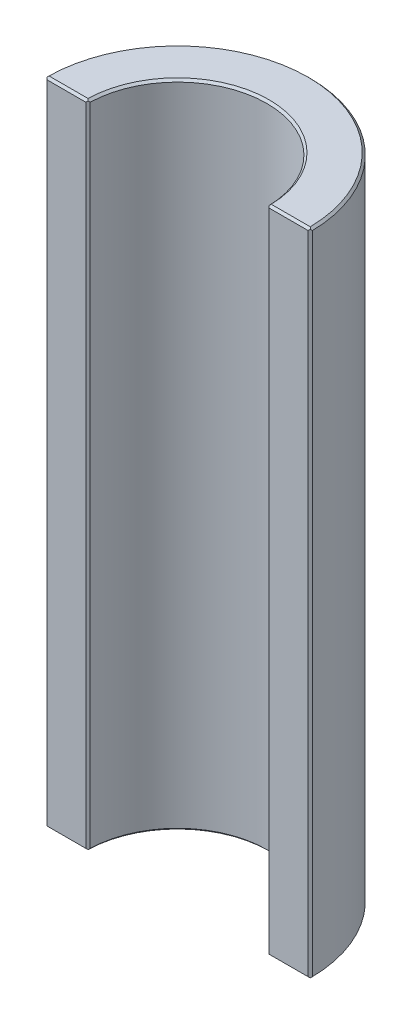
ISO-10303-21;
HEADER;
FILE_DESCRIPTION(('STEP AP214'),'2;1');
FILE_NAME('part.step','',(''),(''),'','','');
FILE_SCHEMA(('AUTOMOTIVE_DESIGN { 1 0 10303 214 1 1 1 1 }'));
ENDSEC;
DATA;
#1=APPLICATION_CONTEXT('core data for automotive mechanical design processes');
#2=APPLICATION_PROTOCOL_DEFINITION('international standard','automotive_design',2000,#1);
#3=PRODUCT_CONTEXT('',#1,'mechanical');
#4=PRODUCT('Part','Part','',(#3));
#5=PRODUCT_RELATED_PRODUCT_CATEGORY('part','',(#4));
#6=PRODUCT_DEFINITION_FORMATION('','',#4);
#7=PRODUCT_DEFINITION_CONTEXT('part definition',#1,'design');
#8=PRODUCT_DEFINITION('design','',#6,#7);
#9=PRODUCT_DEFINITION_SHAPE('','',#8);
#10=(LENGTH_UNIT() NAMED_UNIT(*) SI_UNIT(.MILLI.,.METRE.));
#11=(NAMED_UNIT(*) PLANE_ANGLE_UNIT() SI_UNIT($,.RADIAN.));
#12=(NAMED_UNIT(*) SI_UNIT($,.STERADIAN.) SOLID_ANGLE_UNIT());
#13=UNCERTAINTY_MEASURE_WITH_UNIT(LENGTH_MEASURE(1.E-05),#10,'distance_accuracy_value','');
#14=(GEOMETRIC_REPRESENTATION_CONTEXT(3) GLOBAL_UNCERTAINTY_ASSIGNED_CONTEXT((#13)) GLOBAL_UNIT_ASSIGNED_CONTEXT((#10,
#11,#12)) REPRESENTATION_CONTEXT('',''));
#15=CARTESIAN_POINT('',(0.,0.,0.));
#16=DIRECTION('',(0.,0.,1.));
#17=DIRECTION('',(1.,0.,0.));
#18=AXIS2_PLACEMENT_3D('',#15,#16,#17);
#19=CARTESIAN_POINT('',(0.,120.,0.));
#20=DIRECTION('',(0.,-1.,0.));
#21=DIRECTION('',(0.,0.,-1.));
#22=AXIS2_PLACEMENT_3D('',#19,#20,#21);
#23=CYLINDRICAL_SURFACE('',#22,24.5);
#24=DIRECTION('',(0.,-1.,0.));
#25=VECTOR('',#24,1.);
#26=CARTESIAN_POINT('',(24.4966251700169,120.,-0.406639004149389));
#27=LINE('',#26,#25);
#28=CARTESIAN_POINT('',(24.4966251700169,119.6,-0.406639004149389));
#29=VERTEX_POINT('',#28);
#30=CARTESIAN_POINT('',(24.4966251700169,0.399999999999998,-0.406639004149389));
#31=VERTEX_POINT('',#30);
#32=EDGE_CURVE('E209',#29,#31,#27,.T.);
#33=ORIENTED_EDGE('',*,*,#32,.T.);
#34=CARTESIAN_POINT('',(0.,0.399999999999998,0.));
#35=DIRECTION('',(0.,1.,0.));
#36=DIRECTION('',(0.,0.,1.));
#37=AXIS2_PLACEMENT_3D('',#34,#35,#36);
#38=CIRCLE('',#37,24.5);
#39=CARTESIAN_POINT('',(-24.4966251700169,0.399999999999998,-0.406639004149389));
#40=VERTEX_POINT('',#39);
#41=EDGE_CURVE('E242',#31,#40,#38,.T.);
#42=ORIENTED_EDGE('',*,*,#41,.T.);
#43=DIRECTION('',(0.,-1.,0.));
#44=VECTOR('',#43,1.);
#45=CARTESIAN_POINT('',(-24.4966251700169,120.,-0.406639004149389));
#46=LINE('',#45,#44);
#47=CARTESIAN_POINT('',(-24.4966251700169,119.6,-0.406639004149389));
#48=VERTEX_POINT('',#47);
#49=EDGE_CURVE('E206',#40,#48,#46,.F.);
#50=ORIENTED_EDGE('',*,*,#49,.T.);
#51=CARTESIAN_POINT('',(0.,119.6,0.));
#52=DIRECTION('',(0.,1.,0.));
#53=DIRECTION('',(0.,0.,1.));
#54=AXIS2_PLACEMENT_3D('',#51,#52,#53);
#55=CIRCLE('',#54,24.5);
#56=EDGE_CURVE('E227',#48,#29,#55,.F.);
#57=ORIENTED_EDGE('',*,*,#56,.T.);
#58=EDGE_LOOP('',(#33,#42,#50,#57));
#59=FACE_BOUND('',#58,.T.);
#60=ADVANCED_FACE('F43',(#59),#23,.T.);
#61=CARTESIAN_POINT('',(-24.5,120.,0.));
#62=DIRECTION('',(0.,0.,-1.));
#63=DIRECTION('',(-1.,0.,0.));
#64=AXIS2_PLACEMENT_3D('',#61,#62,#63);
#65=PLANE('',#64);
#66=DIRECTION('',(-1.,0.,0.));
#67=VECTOR('',#66,1.);
#68=CARTESIAN_POINT('',(-24.5,119.6,0.));
#69=LINE('',#68,#67);
#70=CARTESIAN_POINT('',(-16.8952656090397,119.6,0.));
#71=VERTEX_POINT('',#70);
#72=CARTESIAN_POINT('',(-24.0966802692819,119.6,0.));
#73=VERTEX_POINT('',#72);
#74=EDGE_CURVE('E223',#71,#73,#69,.T.);
#75=ORIENTED_EDGE('',*,*,#74,.T.);
#76=DIRECTION('',(0.,-1.,0.));
#77=VECTOR('',#76,1.);
#78=CARTESIAN_POINT('',(-24.0966802692819,120.,0.));
#79=LINE('',#78,#77);
#80=CARTESIAN_POINT('',(-24.0966802692819,0.400000000000011,0.));
#81=VERTEX_POINT('',#80);
#82=EDGE_CURVE('E225',#73,#81,#79,.T.);
#83=ORIENTED_EDGE('',*,*,#82,.T.);
#84=DIRECTION('',(1.,0.,0.));
#85=VECTOR('',#84,1.);
#86=CARTESIAN_POINT('',(-24.5,0.400000000000011,0.));
#87=LINE('',#86,#85);
#88=CARTESIAN_POINT('',(-16.8952656090397,0.400000000000011,0.));
#89=VERTEX_POINT('',#88);
#90=EDGE_CURVE('E218',#81,#89,#87,.T.);
#91=ORIENTED_EDGE('',*,*,#90,.T.);
#92=DIRECTION('',(0.,1.,0.));
#93=VECTOR('',#92,1.);
#94=CARTESIAN_POINT('',(-16.8952656090397,120.,0.));
#95=LINE('',#94,#93);
#96=EDGE_CURVE('E221',#89,#71,#95,.T.);
#97=ORIENTED_EDGE('',*,*,#96,.T.);
#98=EDGE_LOOP('',(#75,#83,#91,#97));
#99=FACE_BOUND('',#98,.T.);
#100=ADVANCED_FACE('F421',(#99),#65,.F.);
#101=CARTESIAN_POINT('',(0.,120.,0.));
#102=DIRECTION('',(0.,-1.,0.));
#103=DIRECTION('',(0.,0.,-1.));
#104=AXIS2_PLACEMENT_3D('',#101,#102,#103);
#105=CYLINDRICAL_SURFACE('',#104,16.5);
#106=DIRECTION('',(0.,-1.,0.));
#107=VECTOR('',#106,1.);
#108=CARTESIAN_POINT('',(-16.4953776656305,120.,-0.390532544378709));
#109=LINE('',#108,#107);
#110=CARTESIAN_POINT('',(-16.4953776656305,119.6,-0.390532544378709));
#111=VERTEX_POINT('',#110);
#112=CARTESIAN_POINT('',(-16.4953776656305,0.399999999999998,-0.390532544378709));
#113=VERTEX_POINT('',#112);
#114=EDGE_CURVE('E191',#111,#113,#109,.T.);
#115=ORIENTED_EDGE('',*,*,#114,.T.);
#116=CARTESIAN_POINT('',(0.,0.399999999999998,0.));
#117=DIRECTION('',(0.,1.,0.));
#118=DIRECTION('',(0.,0.,1.));
#119=AXIS2_PLACEMENT_3D('',#116,#117,#118);
#120=CIRCLE('',#119,16.5);
#121=CARTESIAN_POINT('',(16.4953776656305,0.399999999999998,-0.390532544378709));
#122=VERTEX_POINT('',#121);
#123=EDGE_CURVE('E569',#113,#122,#120,.F.);
#124=ORIENTED_EDGE('',*,*,#123,.T.);
#125=DIRECTION('',(0.,-1.,0.));
#126=VECTOR('',#125,1.);
#127=CARTESIAN_POINT('',(16.4953776656305,120.,-0.390532544378709));
#128=LINE('',#127,#126);
#129=CARTESIAN_POINT('',(16.4953776656305,119.6,-0.390532544378709));
#130=VERTEX_POINT('',#129);
#131=EDGE_CURVE('E194',#122,#130,#128,.F.);
#132=ORIENTED_EDGE('',*,*,#131,.T.);
#133=CARTESIAN_POINT('',(0.,119.6,0.));
#134=DIRECTION('',(0.,1.,0.));
#135=DIRECTION('',(0.,0.,1.));
#136=AXIS2_PLACEMENT_3D('',#133,#134,#135);
#137=CIRCLE('',#136,16.5);
#138=EDGE_CURVE('E572',#130,#111,#137,.T.);
#139=ORIENTED_EDGE('',*,*,#138,.T.);
#140=EDGE_LOOP('',(#115,#124,#132,#139));
#141=FACE_BOUND('',#140,.T.);
#142=ADVANCED_FACE('F428',(#141),#105,.F.);
#143=CARTESIAN_POINT('',(16.5,120.,0.));
#144=DIRECTION('',(0.,0.,-1.));
#145=DIRECTION('',(-1.,0.,0.));
#146=AXIS2_PLACEMENT_3D('',#143,#144,#145);
#147=PLANE('',#146);
#148=DIRECTION('',(-1.,0.,0.));
#149=VECTOR('',#148,1.);
#150=CARTESIAN_POINT('',(16.5,119.6,0.));
#151=LINE('',#150,#149);
#152=CARTESIAN_POINT('',(24.0966802692819,119.6,0.));
#153=VERTEX_POINT('',#152);
#154=CARTESIAN_POINT('',(16.8952656090397,119.6,0.));
#155=VERTEX_POINT('',#154);
#156=EDGE_CURVE('E189',#153,#155,#151,.T.);
#157=ORIENTED_EDGE('',*,*,#156,.T.);
#158=DIRECTION('',(0.,-1.,0.));
#159=VECTOR('',#158,1.);
#160=CARTESIAN_POINT('',(16.8952656090397,120.,0.));
#161=LINE('',#160,#159);
#162=CARTESIAN_POINT('',(16.8952656090397,0.400000000000011,0.));
#163=VERTEX_POINT('',#162);
#164=EDGE_CURVE('E169',#155,#163,#161,.T.);
#165=ORIENTED_EDGE('',*,*,#164,.T.);
#166=DIRECTION('',(1.,0.,0.));
#167=VECTOR('',#166,1.);
#168=CARTESIAN_POINT('',(16.5,0.400000000000011,0.));
#169=LINE('',#168,#167);
#170=CARTESIAN_POINT('',(24.0966802692819,0.400000000000011,0.));
#171=VERTEX_POINT('',#170);
#172=EDGE_CURVE('E177',#163,#171,#169,.T.);
#173=ORIENTED_EDGE('',*,*,#172,.T.);
#174=DIRECTION('',(0.,1.,0.));
#175=VECTOR('',#174,1.);
#176=CARTESIAN_POINT('',(24.0966802692819,120.,0.));
#177=LINE('',#176,#175);
#178=EDGE_CURVE('E184',#171,#153,#177,.T.);
#179=ORIENTED_EDGE('',*,*,#178,.T.);
#180=EDGE_LOOP('',(#157,#165,#173,#179));
#181=FACE_BOUND('',#180,.T.);
#182=ADVANCED_FACE('F187',(#181),#147,.F.);
#183=CARTESIAN_POINT('',(0.,120.,0.));
#184=DIRECTION('',(0.,1.,0.));
#185=DIRECTION('',(0.,0.,1.));
#186=AXIS2_PLACEMENT_3D('',#183,#184,#185);
#187=PLANE('',#186);
#188=DIRECTION('',(1.,0.,0.));
#189=VECTOR('',#188,1.);
#190=CARTESIAN_POINT('',(-16.5,120.,-0.400000000000011));
#191=LINE('',#190,#189);
#192=CARTESIAN_POINT('',(-24.096680269282,120.,-0.400000000000011));
#193=VERTEX_POINT('',#192);
#194=CARTESIAN_POINT('',(-16.8952656090397,120.,-0.400000000000011));
#195=VERTEX_POINT('',#194);
#196=EDGE_CURVE('E201',#193,#195,#191,.T.);
#197=ORIENTED_EDGE('',*,*,#196,.T.);
#198=CARTESIAN_POINT('',(0.,120.,0.));
#199=DIRECTION('',(0.,1.,0.));
#200=DIRECTION('',(0.,0.,1.));
#201=AXIS2_PLACEMENT_3D('',#198,#199,#200);
#202=CIRCLE('',#201,16.9);
#203=CARTESIAN_POINT('',(16.8952656090397,120.,-0.400000000000011));
#204=VERTEX_POINT('',#203);
#205=EDGE_CURVE('E407',#195,#204,#202,.F.);
#206=ORIENTED_EDGE('',*,*,#205,.T.);
#207=DIRECTION('',(1.,0.,0.));
#208=VECTOR('',#207,1.);
#209=CARTESIAN_POINT('',(24.5,120.,-0.400000000000011));
#210=LINE('',#209,#208);
#211=CARTESIAN_POINT('',(24.096680269282,120.,-0.400000000000011));
#212=VERTEX_POINT('',#211);
#213=EDGE_CURVE('E203',#204,#212,#210,.T.);
#214=ORIENTED_EDGE('',*,*,#213,.T.);
#215=CARTESIAN_POINT('',(0.,120.,0.));
#216=DIRECTION('',(0.,1.,0.));
#217=DIRECTION('',(0.,0.,1.));
#218=AXIS2_PLACEMENT_3D('',#215,#216,#217);
#219=CIRCLE('',#218,24.1);
#220=EDGE_CURVE('E406',#212,#193,#219,.T.);
#221=ORIENTED_EDGE('',*,*,#220,.T.);
#222=EDGE_LOOP('',(#197,#206,#214,#221));
#223=FACE_BOUND('',#222,.T.);
#224=ADVANCED_FACE('F415',(#223),#187,.T.);
#225=CARTESIAN_POINT('',(0.,0.,0.));
#226=DIRECTION('',(0.,1.,0.));
#227=DIRECTION('',(0.,0.,1.));
#228=AXIS2_PLACEMENT_3D('',#225,#226,#227);
#229=PLANE('',#228);
#230=DIRECTION('',(-1.,0.,0.));
#231=VECTOR('',#230,1.);
#232=CARTESIAN_POINT('',(0.,0.,-0.400000000000012));
#233=LINE('',#232,#231);
#234=CARTESIAN_POINT('',(-16.8952656090397,0.,-0.400000000000012));
#235=VERTEX_POINT('',#234);
#236=CARTESIAN_POINT('',(-24.0966802692819,0.,-0.400000000000012));
#237=VERTEX_POINT('',#236);
#238=EDGE_CURVE('E212',#235,#237,#233,.T.);
#239=ORIENTED_EDGE('',*,*,#238,.T.);
#240=CARTESIAN_POINT('',(0.,0.,0.));
#241=DIRECTION('',(0.,1.,0.));
#242=DIRECTION('',(0.,0.,1.));
#243=AXIS2_PLACEMENT_3D('',#240,#241,#242);
#244=CIRCLE('',#243,24.1);
#245=CARTESIAN_POINT('',(24.0966802692819,0.,-0.400000000000012));
#246=VERTEX_POINT('',#245);
#247=EDGE_CURVE('E566',#237,#246,#244,.F.);
#248=ORIENTED_EDGE('',*,*,#247,.T.);
#249=DIRECTION('',(-1.,0.,0.));
#250=VECTOR('',#249,1.);
#251=CARTESIAN_POINT('',(0.,0.,-0.400000000000012));
#252=LINE('',#251,#250);
#253=CARTESIAN_POINT('',(16.8952656090397,0.,-0.400000000000012));
#254=VERTEX_POINT('',#253);
#255=EDGE_CURVE('E215',#246,#254,#252,.T.);
#256=ORIENTED_EDGE('',*,*,#255,.T.);
#257=CARTESIAN_POINT('',(0.,0.,0.));
#258=DIRECTION('',(0.,1.,0.));
#259=DIRECTION('',(0.,0.,1.));
#260=AXIS2_PLACEMENT_3D('',#257,#258,#259);
#261=CIRCLE('',#260,16.9);
#262=EDGE_CURVE('E300',#254,#235,#261,.T.);
#263=ORIENTED_EDGE('',*,*,#262,.T.);
#264=EDGE_LOOP('',(#239,#248,#256,#263));
#265=FACE_BOUND('',#264,.T.);
#266=ADVANCED_FACE('F435',(#265),#229,.F.);
#267=CARTESIAN_POINT('',(24.4966251700169,120.,-0.406639004149389));
#268=DIRECTION('',(-0.712950738260874,0.,-0.701214121943701));
#269=DIRECTION('',(0.,-1.,0.));
#270=AXIS2_PLACEMENT_3D('',#267,#268,#269);
#271=PLANE('',#270);
#272=DIRECTION('',(-0.570961687828843,0.580518195680221,0.580518195680221));
#273=VECTOR('',#272,1.);
#274=CARTESIAN_POINT('',(21.6201834002038,2.91794739417949,2.51794739417948));
#275=LINE('',#274,#273);
#276=CARTESIAN_POINT('',(24.296246381414,0.197093637272933,-0.202906362727078));
#277=VERTEX_POINT('',#276);
#278=EDGE_CURVE('E181',#277,#171,#275,.T.);
#279=ORIENTED_EDGE('',*,*,#278,.F.);
#280=CARTESIAN_POINT('',(24.296246381414,0.197093637272933,-0.202906362727079));
#281=CARTESIAN_POINT('',(24.3296886206696,0.230819430337007,-0.236908343605977));
#282=CARTESIAN_POINT('',(24.3631079727455,0.264591190495307,-0.270887054229624));
#283=CARTESIAN_POINT('',(24.4299009022795,0.332226644738374,-0.338797934703367));
#284=CARTESIAN_POINT('',(24.4632744797378,0.36609033882243,-0.372730104553824));
#285=CARTESIAN_POINT('',(24.4966251700169,0.399999999999999,-0.40663900414939));
#286=B_SPLINE_CURVE_WITH_KNOTS('',3,(#280,#281,#282,#283,#284,#285),.UNSPECIFIED.,.F.,.F.,(4,2,
4),(0.,0.175235381350621,0.350470761343707),.UNSPECIFIED.);
#287=EDGE_CURVE('E575',#277,#31,#286,.T.);
#288=ORIENTED_EDGE('',*,*,#287,.T.);
#289=ORIENTED_EDGE('',*,*,#32,.F.);
#290=CARTESIAN_POINT('',(24.4966251700169,119.6,-0.406639004149389));
#291=CARTESIAN_POINT('',(24.4632744797378,119.633909661178,-0.372730104553827));
#292=CARTESIAN_POINT('',(24.4299009022795,119.667773355262,-0.338797934703373));
#293=CARTESIAN_POINT('',(24.3631079727455,119.735408809505,-0.270887054229633));
#294=CARTESIAN_POINT('',(24.3296886206696,119.769180569663,-0.236908343605987));
#295=CARTESIAN_POINT('',(24.296246381414,119.802906362727,-0.20290636272709));
#296=B_SPLINE_CURVE_WITH_KNOTS('',3,(#290,#291,#292,#293,#294,#295),.UNSPECIFIED.,.F.,.F.,(4,2,
4),(0.,0.175235379993074,0.35047076134368),.UNSPECIFIED.);
#297=CARTESIAN_POINT('',(24.296246381414,119.802906362727,-0.20290636272709));
#298=VERTEX_POINT('',#297);
#299=EDGE_CURVE('E326',#29,#298,#296,.T.);
#300=ORIENTED_EDGE('',*,*,#299,.T.);
#301=DIRECTION('',(0.570961687828843,0.580518195680221,-0.580518195680221));
#302=VECTOR('',#301,1.);
#303=CARTESIAN_POINT('',(24.494424647867,120.004401650619,-0.404401650618994));
#304=LINE('',#303,#302);
#305=EDGE_CURVE('E185',#153,#298,#304,.T.);
#306=ORIENTED_EDGE('',*,*,#305,.F.);
#307=ORIENTED_EDGE('',*,*,#178,.F.);
#308=EDGE_LOOP('',(#279,#288,#289,#300,#306,#307));
#309=FACE_BOUND('',#308,.T.);
#310=ADVANCED_FACE('F273',(#309),#271,.F.);
#311=CARTESIAN_POINT('',(0.,120.,-0.400000000000011));
#312=DIRECTION('',(0.,0.707106781186548,0.707106781186548));
#313=DIRECTION('',(-1.,0.,0.));
#314=AXIS2_PLACEMENT_3D('',#311,#312,#313);
#315=PLANE('',#314);
#316=ORIENTED_EDGE('',*,*,#213,.F.);
#317=CARTESIAN_POINT('',(16.8952656090397,120.,-0.400000000000011));
#318=CARTESIAN_POINT('',(16.8619746824803,119.965910755472,-0.365910755472117));
#319=CARTESIAN_POINT('',(16.8286164511445,119.931854572258,-0.331854572258257));
#320=CARTESIAN_POINT('',(16.7617653781253,119.86380832765,-0.263808327649576));
#321=CARTESIAN_POINT('',(16.7282725364386,119.829818266256,-0.229818266256328));
#322=CARTESIAN_POINT('',(16.6947123899723,119.795861266179,-0.195861266178686));
#323=B_SPLINE_CURVE_WITH_KNOTS('',3,(#317,#318,#319,#320,#321,#322),.UNSPECIFIED.,.F.,.F.,(4,2,
4),(0.,0.175760545778613,0.351521095736601),.UNSPECIFIED.);
#324=CARTESIAN_POINT('',(16.6947123899723,119.795861266179,-0.195861266178684));
#325=VERTEX_POINT('',#324);
#326=EDGE_CURVE('E362',#204,#325,#323,.T.);
#327=ORIENTED_EDGE('',*,*,#326,.T.);
#328=DIRECTION('',(-0.586460895294597,0.572740612446097,-0.572740612446097));
#329=VECTOR('',#328,1.);
#330=CARTESIAN_POINT('',(10.8156571095642,125.537375745527,-5.93737574552685));
#331=LINE('',#330,#329);
#332=EDGE_CURVE('E173',#155,#325,#331,.T.);
#333=ORIENTED_EDGE('',*,*,#332,.F.);
#334=ORIENTED_EDGE('',*,*,#156,.F.);
#335=ORIENTED_EDGE('',*,*,#305,.T.);
#336=CARTESIAN_POINT('',(24.296246381414,119.802906362727,-0.202906362727089));
#337=CARTESIAN_POINT('',(24.2630760423387,119.835801210659,-0.235801210659445));
#338=CARTESIAN_POINT('',(24.2298603635213,119.868673104335,-0.268673104334742));
#339=CARTESIAN_POINT('',(24.1633383261447,119.934370983426,-0.334370983426073));
#340=CARTESIAN_POINT('',(24.1300319675847,119.967196968842,-0.367196968841751));
#341=CARTESIAN_POINT('',(24.096680269282,120.,-0.400000000000013));
#342=B_SPLINE_CURVE_WITH_KNOTS('',3,(#336,#337,#338,#339,#340,#341),.UNSPECIFIED.,.F.,.F.,(4,2,
4),(0.,0.171404891884884,0.342809785099596),.UNSPECIFIED.);
#343=EDGE_CURVE('E355',#298,#212,#342,.T.);
#344=ORIENTED_EDGE('',*,*,#343,.T.);
#345=EDGE_LOOP('',(#316,#327,#333,#334,#335,#344));
#346=FACE_BOUND('',#345,.T.);
#347=ADVANCED_FACE('F344',(#346),#315,.T.);
#348=CARTESIAN_POINT('',(16.5,0.400000000000011,0.));
#349=DIRECTION('',(0.,0.707106781186548,-0.707106781186548));
#350=DIRECTION('',(1.,0.,0.));
#351=AXIS2_PLACEMENT_3D('',#348,#349,#350);
#352=PLANE('',#351);
#353=ORIENTED_EDGE('',*,*,#255,.F.);
#354=CARTESIAN_POINT('',(24.0966802692819,0.,-0.400000000000012));
#355=CARTESIAN_POINT('',(24.1300319675846,0.0328030311582622,-0.367196968841749));
#356=CARTESIAN_POINT('',(24.1633383261447,0.0656290165739405,-0.334370983426071));
#357=CARTESIAN_POINT('',(24.2298603635213,0.131326895665274,-0.268673104334737));
#358=CARTESIAN_POINT('',(24.2630760423387,0.164198789340574,-0.235801210659438));
#359=CARTESIAN_POINT('',(24.296246381414,0.197093637272933,-0.202906362727078));
#360=B_SPLINE_CURVE_WITH_KNOTS('',3,(#354,#355,#356,#357,#358,#359),.UNSPECIFIED.,.F.,.F.,(4,2,
4),(0.,0.17140489321472,0.342809785099614),.UNSPECIFIED.);
#361=EDGE_CURVE('E318',#246,#277,#360,.T.);
#362=ORIENTED_EDGE('',*,*,#361,.T.);
#363=ORIENTED_EDGE('',*,*,#278,.T.);
#364=ORIENTED_EDGE('',*,*,#172,.F.);
#365=DIRECTION('',(-0.586460895294597,-0.572740612446097,-0.572740612446097));
#366=VECTOR('',#365,1.);
#367=CARTESIAN_POINT('',(16.7593193856523,0.267234245510053,-0.132765754489959));
#368=LINE('',#367,#366);
#369=CARTESIAN_POINT('',(16.6947123899723,0.204138733821325,-0.195861266178687));
#370=VERTEX_POINT('',#369);
#371=EDGE_CURVE('E163',#370,#163,#368,.F.);
#372=ORIENTED_EDGE('',*,*,#371,.F.);
#373=CARTESIAN_POINT('',(16.6947123899723,0.204138733821325,-0.195861266178686));
#374=CARTESIAN_POINT('',(16.7282725364386,0.170181733743684,-0.229818266256327));
#375=CARTESIAN_POINT('',(16.7617653781253,0.136191672350436,-0.263808327649575));
#376=CARTESIAN_POINT('',(16.8286164511446,0.0681454277417557,-0.331854572258256));
#377=CARTESIAN_POINT('',(16.8619746824804,0.0340892445278956,-0.365910755472116));
#378=CARTESIAN_POINT('',(16.8952656090397,0.,-0.400000000000011));
#379=B_SPLINE_CURVE_WITH_KNOTS('',3,(#373,#374,#375,#376,#377,#378),.UNSPECIFIED.,.F.,.F.,(4,2,
4),(0.,0.175760549957989,0.351521095736602),.UNSPECIFIED.);
#380=EDGE_CURVE('E327',#370,#254,#379,.T.);
#381=ORIENTED_EDGE('',*,*,#380,.T.);
#382=EDGE_LOOP('',(#353,#362,#363,#364,#372,#381));
#383=FACE_BOUND('',#382,.T.);
#384=ADVANCED_FACE('F179',(#383),#352,.F.);
#385=CARTESIAN_POINT('',(16.8952656090397,120.,0.));
#386=DIRECTION('',(0.698688543253268,0.,-0.715425970682241));
#387=DIRECTION('',(0.,-1.,0.));
#388=AXIS2_PLACEMENT_3D('',#385,#386,#387);
#389=PLANE('',#388);
#390=ORIENTED_EDGE('',*,*,#131,.F.);
#391=CARTESIAN_POINT('',(16.4953776656305,0.399999999999998,-0.390532544378709));
#392=CARTESIAN_POINT('',(16.5286664825994,0.36748841085353,-0.358022520997208));
#393=CARTESIAN_POINT('',(16.5619221183098,0.334910843903552,-0.325544902596955));
#394=CARTESIAN_POINT('',(16.6283670264221,0.269623755174185,-0.260654476531824));
#395=CARTESIAN_POINT('',(16.6615562988257,0.236914233397939,-0.228241668865403));
#396=CARTESIAN_POINT('',(16.6947123899723,0.204138733821326,-0.195861266178686));
#397=B_SPLINE_CURVE_WITH_KNOTS('',3,(#391,#392,#393,#394,#395,#396),.UNSPECIFIED.,.F.,.F.,(4,2,
4),(0.,0.170288807167442,0.340577610278406),.UNSPECIFIED.);
#398=EDGE_CURVE('E170',#122,#370,#397,.T.);
#399=ORIENTED_EDGE('',*,*,#398,.T.);
#400=ORIENTED_EDGE('',*,*,#371,.T.);
#401=ORIENTED_EDGE('',*,*,#164,.F.);
#402=ORIENTED_EDGE('',*,*,#332,.T.);
#403=CARTESIAN_POINT('',(16.6947123899723,119.795861266179,-0.19586126617869));
#404=CARTESIAN_POINT('',(16.6615562988257,119.763085766602,-0.228241668865407));
#405=CARTESIAN_POINT('',(16.6283670264221,119.730376244826,-0.260654476531828));
#406=CARTESIAN_POINT('',(16.5619221183098,119.665089156096,-0.325544902596957));
#407=CARTESIAN_POINT('',(16.5286664825994,119.632511589146,-0.35802252099721));
#408=CARTESIAN_POINT('',(16.4953776656305,119.6,-0.390532544378709));
#409=B_SPLINE_CURVE_WITH_KNOTS('',3,(#403,#404,#405,#406,#407,#408),.UNSPECIFIED.,.F.,.F.,(4,2,
4),(0.,0.170288803110958,0.34057761027839),.UNSPECIFIED.);
#410=EDGE_CURVE('E381',#325,#130,#409,.T.);
#411=ORIENTED_EDGE('',*,*,#410,.T.);
#412=EDGE_LOOP('',(#390,#399,#400,#401,#402,#411));
#413=FACE_BOUND('',#412,.T.);
#414=ADVANCED_FACE('F166',(#413),#389,.F.);
#415=CARTESIAN_POINT('',(-16.4953776656305,120.,-0.390532544378709));
#416=DIRECTION('',(-0.698688543253268,0.,-0.715425970682241));
#417=DIRECTION('',(0.,-1.,0.));
#418=AXIS2_PLACEMENT_3D('',#415,#416,#417);
#419=PLANE('',#418);
#420=DIRECTION('',(-0.586460895294597,0.572740612446097,0.572740612446097));
#421=VECTOR('',#420,1.);
#422=CARTESIAN_POINT('',(-19.5108104393302,2.95435402428376,2.55435402428375));
#423=LINE('',#422,#421);
#424=CARTESIAN_POINT('',(-16.6947123899723,0.204138733821324,-0.195861266178687));
#425=VERTEX_POINT('',#424);
#426=EDGE_CURVE('E238',#425,#89,#423,.T.);
#427=ORIENTED_EDGE('',*,*,#426,.F.);
#428=CARTESIAN_POINT('',(-16.6947123899723,0.204138733821325,-0.195861266178686));
#429=CARTESIAN_POINT('',(-16.6615562988257,0.236914233397938,-0.228241668865404));
#430=CARTESIAN_POINT('',(-16.6283670264221,0.269623755174185,-0.260654476531824));
#431=CARTESIAN_POINT('',(-16.5619221183098,0.334910843903553,-0.325544902596955));
#432=CARTESIAN_POINT('',(-16.5286664825994,0.367488410853531,-0.358022520997209));
#433=CARTESIAN_POINT('',(-16.4953776656305,0.399999999999998,-0.39053254437871));
#434=B_SPLINE_CURVE_WITH_KNOTS('',3,(#428,#429,#430,#431,#432,#433),.UNSPECIFIED.,.F.,.F.,(4,2,
4),(0.,0.170288803110965,0.340577610278407),.UNSPECIFIED.);
#435=EDGE_CURVE('E396',#425,#113,#434,.T.);
#436=ORIENTED_EDGE('',*,*,#435,.T.);
#437=ORIENTED_EDGE('',*,*,#114,.F.);
#438=CARTESIAN_POINT('',(-16.4953776656305,119.6,-0.390532544378709));
#439=CARTESIAN_POINT('',(-16.5286664825994,119.632511589146,-0.35802252099721));
#440=CARTESIAN_POINT('',(-16.5619221183098,119.665089156096,-0.325544902596957));
#441=CARTESIAN_POINT('',(-16.6283670264221,119.730376244826,-0.260654476531829));
#442=CARTESIAN_POINT('',(-16.6615562988257,119.763085766602,-0.228241668865409));
#443=CARTESIAN_POINT('',(-16.6947123899723,119.795861266179,-0.195861266178693));
#444=B_SPLINE_CURVE_WITH_KNOTS('',3,(#438,#439,#440,#441,#442,#443),.UNSPECIFIED.,.F.,.F.,(4,2,
4),(0.,0.170288807167432,0.340577610278388),.UNSPECIFIED.);
#445=CARTESIAN_POINT('',(-16.6947123899723,119.795861266179,-0.195861266178689));
#446=VERTEX_POINT('',#445);
#447=EDGE_CURVE('E390',#111,#446,#444,.T.);
#448=ORIENTED_EDGE('',*,*,#447,.T.);
#449=DIRECTION('',(0.586460895294597,0.572740612446097,-0.572740612446097));
#450=VECTOR('',#449,1.);
#451=CARTESIAN_POINT('',(-16.4921976422237,119.993638170974,-0.393638170974166));
#452=LINE('',#451,#450);
#453=EDGE_CURVE('E174',#71,#446,#452,.T.);
#454=ORIENTED_EDGE('',*,*,#453,.F.);
#455=ORIENTED_EDGE('',*,*,#96,.F.);
#456=EDGE_LOOP('',(#427,#436,#437,#448,#454,#455));
#457=FACE_BOUND('',#456,.T.);
#458=ADVANCED_FACE('F310',(#457),#419,.F.);
#459=CARTESIAN_POINT('',(0.,120.,-0.400000000000011));
#460=DIRECTION('',(0.,0.707106781186548,0.707106781186548));
#461=DIRECTION('',(-1.,0.,0.));
#462=AXIS2_PLACEMENT_3D('',#459,#460,#461);
#463=PLANE('',#462);
#464=ORIENTED_EDGE('',*,*,#453,.T.);
#465=CARTESIAN_POINT('',(-16.6947123899723,119.795861266179,-0.195861266178694));
#466=CARTESIAN_POINT('',(-16.7282725364386,119.829818266256,-0.229818266256333));
#467=CARTESIAN_POINT('',(-16.7617653781253,119.86380832765,-0.263808327649579));
#468=CARTESIAN_POINT('',(-16.8286164511446,119.931854572258,-0.331854572258258));
#469=CARTESIAN_POINT('',(-16.8619746824803,119.965910755472,-0.365910755472118));
#470=CARTESIAN_POINT('',(-16.8952656090397,120.,-0.400000000000014));
#471=B_SPLINE_CURVE_WITH_KNOTS('',3,(#465,#466,#467,#468,#469,#470),.UNSPECIFIED.,.F.,.F.,(4,2,
4),(0.,0.175760549957984,0.351521095736598),.UNSPECIFIED.);
#472=EDGE_CURVE('E11',#446,#195,#471,.T.);
#473=ORIENTED_EDGE('',*,*,#472,.T.);
#474=ORIENTED_EDGE('',*,*,#196,.F.);
#475=CARTESIAN_POINT('',(-24.096680269282,120.,-0.400000000000011));
#476=CARTESIAN_POINT('',(-24.1300319675847,119.967196968842,-0.367196968841753));
#477=CARTESIAN_POINT('',(-24.1633383261447,119.934370983426,-0.334370983426077));
#478=CARTESIAN_POINT('',(-24.2298603635213,119.868673104335,-0.26867310433475));
#479=CARTESIAN_POINT('',(-24.2630760423387,119.835801210659,-0.235801210659454));
#480=CARTESIAN_POINT('',(-24.296246381414,119.802906362727,-0.202906362727098));
#481=B_SPLINE_CURVE_WITH_KNOTS('',3,(#475,#476,#477,#478,#479,#480),.UNSPECIFIED.,.F.,.F.,(4,2,
4),(0.,0.171404893214703,0.342809785099578),.UNSPECIFIED.);
#482=CARTESIAN_POINT('',(-24.296246381414,119.802906362727,-0.202906362727094));
#483=VERTEX_POINT('',#482);
#484=EDGE_CURVE('E58',#193,#483,#481,.T.);
#485=ORIENTED_EDGE('',*,*,#484,.T.);
#486=DIRECTION('',(-0.570961687828843,0.580518195680221,-0.580518195680221));
#487=VECTOR('',#486,1.);
#488=CARTESIAN_POINT('',(-16.5063917112826,111.882668500688,7.71733149931221));
#489=LINE('',#488,#487);
#490=EDGE_CURVE('E235',#73,#483,#489,.T.);
#491=ORIENTED_EDGE('',*,*,#490,.F.);
#492=ORIENTED_EDGE('',*,*,#74,.F.);
#493=EDGE_LOOP('',(#464,#473,#474,#485,#491,#492));
#494=FACE_BOUND('',#493,.T.);
#495=ADVANCED_FACE('F282',(#494),#463,.T.);
#496=CARTESIAN_POINT('',(-24.5,0.400000000000011,0.));
#497=DIRECTION('',(0.,0.707106781186548,-0.707106781186548));
#498=DIRECTION('',(1.,0.,0.));
#499=AXIS2_PLACEMENT_3D('',#496,#497,#498);
#500=PLANE('',#499);
#501=DIRECTION('',(-0.570961687828843,-0.580518195680221,-0.580518195680221));
#502=VECTOR('',#501,1.);
#503=CARTESIAN_POINT('',(-24.2281613919507,0.26631820361202,-0.133681796387992));
#504=LINE('',#503,#502);
#505=CARTESIAN_POINT('',(-24.296246381414,0.197093637272937,-0.202906362727074));
#506=VERTEX_POINT('',#505);
#507=EDGE_CURVE('E233',#506,#81,#504,.F.);
#508=ORIENTED_EDGE('',*,*,#507,.F.);
#509=CARTESIAN_POINT('',(-24.296246381414,0.197093637272936,-0.202906362727075));
#510=CARTESIAN_POINT('',(-24.2630760423387,0.164198789340576,-0.235801210659435));
#511=CARTESIAN_POINT('',(-24.2298603635213,0.131326895665276,-0.268673104334736));
#512=CARTESIAN_POINT('',(-24.1633383261447,0.0656290165739409,-0.334370983426071));
#513=CARTESIAN_POINT('',(-24.1300319675846,0.0328030311582622,-0.367196968841749));
#514=CARTESIAN_POINT('',(-24.0966802692819,0.,-0.400000000000012));
#515=B_SPLINE_CURVE_WITH_KNOTS('',3,(#509,#510,#511,#512,#513,#514),.UNSPECIFIED.,.F.,.F.,(4,2,
4),(0.,0.171404891884897,0.34280978509962),.UNSPECIFIED.);
#516=EDGE_CURVE('E294',#506,#237,#515,.T.);
#517=ORIENTED_EDGE('',*,*,#516,.T.);
#518=ORIENTED_EDGE('',*,*,#238,.F.);
#519=CARTESIAN_POINT('',(-16.8952656090397,0.,-0.400000000000012));
#520=CARTESIAN_POINT('',(-16.8619746824803,0.0340892445278951,-0.365910755472116));
#521=CARTESIAN_POINT('',(-16.8286164511446,0.0681454277417555,-0.331854572258256));
#522=CARTESIAN_POINT('',(-16.7617653781253,0.136191672350437,-0.263808327649575));
#523=CARTESIAN_POINT('',(-16.7282725364386,0.170181733743685,-0.229818266256327));
#524=CARTESIAN_POINT('',(-16.6947123899723,0.204138733821326,-0.195861266178685));
#525=B_SPLINE_CURVE_WITH_KNOTS('',3,(#519,#520,#521,#522,#523,#524),.UNSPECIFIED.,.F.,.F.,(4,2,
4),(0.,0.175760545778612,0.3515210957366),.UNSPECIFIED.);
#526=EDGE_CURVE('E287',#235,#425,#525,.T.);
#527=ORIENTED_EDGE('',*,*,#526,.T.);
#528=ORIENTED_EDGE('',*,*,#426,.T.);
#529=ORIENTED_EDGE('',*,*,#90,.F.);
#530=EDGE_LOOP('',(#508,#517,#518,#527,#528,#529));
#531=FACE_BOUND('',#530,.T.);
#532=ADVANCED_FACE('F270',(#531),#500,.F.);
#533=CARTESIAN_POINT('',(-24.0966802692819,120.,0.));
#534=DIRECTION('',(0.712950738260874,0.,-0.701214121943701));
#535=DIRECTION('',(0.,-1.,0.));
#536=AXIS2_PLACEMENT_3D('',#533,#534,#535);
#537=PLANE('',#536);
#538=ORIENTED_EDGE('',*,*,#49,.F.);
#539=CARTESIAN_POINT('',(-24.4966251700169,0.399999999999998,-0.406639004149389));
#540=CARTESIAN_POINT('',(-24.4632744797378,0.366090338822428,-0.372730104553823));
#541=CARTESIAN_POINT('',(-24.4299009022795,0.332226644738373,-0.338797934703367));
#542=CARTESIAN_POINT('',(-24.3631079727455,0.264591190495306,-0.270887054229623));
#543=CARTESIAN_POINT('',(-24.3296886206696,0.230819430337007,-0.236908343605975));
#544=CARTESIAN_POINT('',(-24.296246381414,0.197093637272934,-0.202906362727075));
#545=B_SPLINE_CURVE_WITH_KNOTS('',3,(#539,#540,#541,#542,#543,#544),.UNSPECIFIED.,.F.,.F.,(4,2,
4),(0.,0.175235379993085,0.350470761343706),.UNSPECIFIED.);
#546=EDGE_CURVE('E252',#40,#506,#545,.T.);
#547=ORIENTED_EDGE('',*,*,#546,.T.);
#548=ORIENTED_EDGE('',*,*,#507,.T.);
#549=ORIENTED_EDGE('',*,*,#82,.F.);
#550=ORIENTED_EDGE('',*,*,#490,.T.);
#551=CARTESIAN_POINT('',(-24.296246381414,119.802906362727,-0.202906362727092));
#552=CARTESIAN_POINT('',(-24.3296886206696,119.769180569663,-0.236908343605988));
#553=CARTESIAN_POINT('',(-24.3631079727455,119.735408809505,-0.270887054229633));
#554=CARTESIAN_POINT('',(-24.4299009022795,119.667773355262,-0.338797934703373));
#555=CARTESIAN_POINT('',(-24.4632744797378,119.633909661178,-0.372730104553827));
#556=CARTESIAN_POINT('',(-24.4966251700169,119.6,-0.406639004149392));
#557=B_SPLINE_CURVE_WITH_KNOTS('',3,(#551,#552,#553,#554,#555,#556),.UNSPECIFIED.,.F.,.F.,(4,2,
4),(0.,0.175235381350617,0.350470761343692),.UNSPECIFIED.);
#558=EDGE_CURVE('E245',#483,#48,#557,.T.);
#559=ORIENTED_EDGE('',*,*,#558,.T.);
#560=EDGE_LOOP('',(#538,#547,#548,#549,#550,#559));
#561=FACE_BOUND('',#560,.T.);
#562=ADVANCED_FACE('F260',(#561),#537,.F.);
#563=CARTESIAN_POINT('',(0.,0.399999999999998,0.));
#564=DIRECTION('',(0.,1.,0.));
#565=DIRECTION('',(0.,0.,1.));
#566=AXIS2_PLACEMENT_3D('',#563,#564,#565);
#567=CONICAL_SURFACE('',#566,24.5,0.785398163397431);
#568=ORIENTED_EDGE('',*,*,#361,.F.);
#569=ORIENTED_EDGE('',*,*,#247,.F.);
#570=ORIENTED_EDGE('',*,*,#516,.F.);
#571=ORIENTED_EDGE('',*,*,#546,.F.);
#572=ORIENTED_EDGE('',*,*,#41,.F.);
#573=ORIENTED_EDGE('',*,*,#287,.F.);
#574=EDGE_LOOP('',(#568,#569,#570,#571,#572,#573));
#575=FACE_BOUND('',#574,.T.);
#576=ADVANCED_FACE('F269',(#575),#567,.T.);
#577=CARTESIAN_POINT('',(0.,0.399999999999998,0.));
#578=DIRECTION('',(0.,-1.,0.));
#579=DIRECTION('',(0.,0.,-1.));
#580=AXIS2_PLACEMENT_3D('',#577,#578,#579);
#581=CONICAL_SURFACE('',#580,16.5,0.785398163397444);
#582=ORIENTED_EDGE('',*,*,#526,.F.);
#583=ORIENTED_EDGE('',*,*,#262,.F.);
#584=ORIENTED_EDGE('',*,*,#380,.F.);
#585=ORIENTED_EDGE('',*,*,#398,.F.);
#586=ORIENTED_EDGE('',*,*,#123,.F.);
#587=ORIENTED_EDGE('',*,*,#435,.F.);
#588=EDGE_LOOP('',(#582,#583,#584,#585,#586,#587));
#589=FACE_BOUND('',#588,.T.);
#590=ADVANCED_FACE('F307',(#589),#581,.F.);
#591=CARTESIAN_POINT('',(0.,120.,0.));
#592=DIRECTION('',(0.,1.,0.));
#593=DIRECTION('',(0.,0.,1.));
#594=AXIS2_PLACEMENT_3D('',#591,#592,#593);
#595=CONICAL_SURFACE('',#594,16.9,0.785398163397444);
#596=ORIENTED_EDGE('',*,*,#447,.F.);
#597=ORIENTED_EDGE('',*,*,#138,.F.);
#598=ORIENTED_EDGE('',*,*,#410,.F.);
#599=ORIENTED_EDGE('',*,*,#326,.F.);
#600=ORIENTED_EDGE('',*,*,#205,.F.);
#601=ORIENTED_EDGE('',*,*,#472,.F.);
#602=EDGE_LOOP('',(#596,#597,#598,#599,#600,#601));
#603=FACE_BOUND('',#602,.T.);
#604=ADVANCED_FACE('F372',(#603),#595,.F.);
#605=CARTESIAN_POINT('',(0.,120.,0.));
#606=DIRECTION('',(0.,-1.,0.));
#607=DIRECTION('',(0.,0.,-1.));
#608=AXIS2_PLACEMENT_3D('',#605,#606,#607);
#609=CONICAL_SURFACE('',#608,24.1,0.785398163397431);
#610=ORIENTED_EDGE('',*,*,#299,.F.);
#611=ORIENTED_EDGE('',*,*,#56,.F.);
#612=ORIENTED_EDGE('',*,*,#558,.F.);
#613=ORIENTED_EDGE('',*,*,#484,.F.);
#614=ORIENTED_EDGE('',*,*,#220,.F.);
#615=ORIENTED_EDGE('',*,*,#343,.F.);
#616=EDGE_LOOP('',(#610,#611,#612,#613,#614,#615));
#617=FACE_BOUND('',#616,.T.);
#618=ADVANCED_FACE('F46',(#617),#609,.T.);
#619=CLOSED_SHELL('',(#60,#100,#142,#182,#224,#266,#310,#347,#384,#414,#458,#495,#532,#562,#576,
#590,#604,#618));
#620=MANIFOLD_SOLID_BREP('B2',#619);
#621=ADVANCED_BREP_SHAPE_REPRESENTATION('',(#18,#620),#14);
#622=SHAPE_DEFINITION_REPRESENTATION(#9,#621);
ENDSEC;
END-ISO-10303-21;
